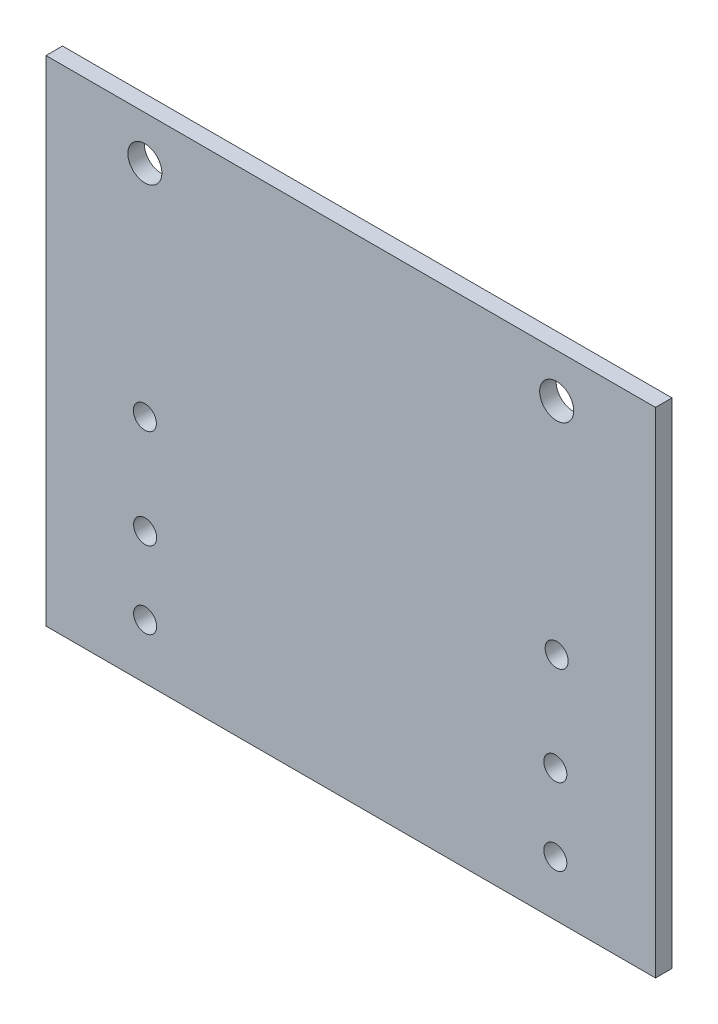
ISO-10303-21;
HEADER;
FILE_DESCRIPTION(('STEP AP214'),'2;1');
FILE_NAME('part.step','',(''),(''),'','','');
FILE_SCHEMA(('AUTOMOTIVE_DESIGN { 1 0 10303 214 1 1 1 1 }'));
ENDSEC;
DATA;
#1=APPLICATION_CONTEXT('core data for automotive mechanical design processes');
#2=APPLICATION_PROTOCOL_DEFINITION('international standard','automotive_design',2000,#1);
#3=PRODUCT_CONTEXT('',#1,'mechanical');
#4=PRODUCT('Part','Part','',(#3));
#5=PRODUCT_RELATED_PRODUCT_CATEGORY('part','',(#4));
#6=PRODUCT_DEFINITION_FORMATION('','',#4);
#7=PRODUCT_DEFINITION_CONTEXT('part definition',#1,'design');
#8=PRODUCT_DEFINITION('design','',#6,#7);
#9=PRODUCT_DEFINITION_SHAPE('','',#8);
#10=(LENGTH_UNIT() NAMED_UNIT(*) SI_UNIT(.MILLI.,.METRE.));
#11=(NAMED_UNIT(*) PLANE_ANGLE_UNIT() SI_UNIT($,.RADIAN.));
#12=(NAMED_UNIT(*) SI_UNIT($,.STERADIAN.) SOLID_ANGLE_UNIT());
#13=UNCERTAINTY_MEASURE_WITH_UNIT(LENGTH_MEASURE(1.E-05),#10,'distance_accuracy_value','');
#14=(GEOMETRIC_REPRESENTATION_CONTEXT(3) GLOBAL_UNCERTAINTY_ASSIGNED_CONTEXT((#13)) GLOBAL_UNIT_ASSIGNED_CONTEXT((#10,
#11,#12)) REPRESENTATION_CONTEXT('',''));
#15=CARTESIAN_POINT('',(0.,0.,0.));
#16=DIRECTION('',(0.,0.,1.));
#17=DIRECTION('',(1.,0.,0.));
#18=AXIS2_PLACEMENT_3D('',#15,#16,#17);
#19=CARTESIAN_POINT('',(0.,0.,3.));
#20=DIRECTION('',(1.,0.,0.));
#21=DIRECTION('',(0.,0.,-1.));
#22=AXIS2_PLACEMENT_3D('',#19,#20,#21);
#23=PLANE('',#22);
#24=DIRECTION('',(0.,-1.,0.));
#25=VECTOR('',#24,1.);
#26=CARTESIAN_POINT('',(0.,0.,0.));
#27=LINE('',#26,#25);
#28=CARTESIAN_POINT('',(0.,90.,0.));
#29=VERTEX_POINT('',#28);
#30=CARTESIAN_POINT('',(0.,0.,0.));
#31=VERTEX_POINT('',#30);
#32=EDGE_CURVE('E112',#29,#31,#27,.T.);
#33=ORIENTED_EDGE('',*,*,#32,.T.);
#34=DIRECTION('',(0.,0.,-1.));
#35=VECTOR('',#34,1.);
#36=CARTESIAN_POINT('',(0.,0.,3.));
#37=LINE('',#36,#35);
#38=CARTESIAN_POINT('',(0.,0.,3.));
#39=VERTEX_POINT('',#38);
#40=EDGE_CURVE('E11',#39,#31,#37,.T.);
#41=ORIENTED_EDGE('',*,*,#40,.F.);
#42=DIRECTION('',(0.,-1.,0.));
#43=VECTOR('',#42,1.);
#44=CARTESIAN_POINT('',(0.,0.,3.));
#45=LINE('',#44,#43);
#46=CARTESIAN_POINT('',(0.,90.,3.));
#47=VERTEX_POINT('',#46);
#48=EDGE_CURVE('E96',#47,#39,#45,.T.);
#49=ORIENTED_EDGE('',*,*,#48,.F.);
#50=DIRECTION('',(0.,0.,-1.));
#51=VECTOR('',#50,1.);
#52=CARTESIAN_POINT('',(0.,90.,3.));
#53=LINE('',#52,#51);
#54=EDGE_CURVE('E108',#47,#29,#53,.T.);
#55=ORIENTED_EDGE('',*,*,#54,.T.);
#56=EDGE_LOOP('',(#33,#41,#49,#55));
#57=FACE_BOUND('',#56,.T.);
#58=ADVANCED_FACE('F44',(#57),#23,.F.);
#59=CARTESIAN_POINT('',(0.,0.,3.));
#60=DIRECTION('',(0.,1.,0.));
#61=DIRECTION('',(0.,0.,1.));
#62=AXIS2_PLACEMENT_3D('',#59,#60,#61);
#63=PLANE('',#62);
#64=DIRECTION('',(1.,0.,0.));
#65=VECTOR('',#64,1.);
#66=CARTESIAN_POINT('',(0.,0.,0.));
#67=LINE('',#66,#65);
#68=CARTESIAN_POINT('',(111.,0.,0.));
#69=VERTEX_POINT('',#68);
#70=EDGE_CURVE('E101',#31,#69,#67,.T.);
#71=ORIENTED_EDGE('',*,*,#70,.T.);
#72=DIRECTION('',(0.,0.,-1.));
#73=VECTOR('',#72,1.);
#74=CARTESIAN_POINT('',(111.,0.,3.));
#75=LINE('',#74,#73);
#76=CARTESIAN_POINT('',(111.,0.,3.));
#77=VERTEX_POINT('',#76);
#78=EDGE_CURVE('E53',#77,#69,#75,.T.);
#79=ORIENTED_EDGE('',*,*,#78,.F.);
#80=DIRECTION('',(1.,0.,0.));
#81=VECTOR('',#80,1.);
#82=CARTESIAN_POINT('',(0.,0.,3.));
#83=LINE('',#82,#81);
#84=EDGE_CURVE('E91',#39,#77,#83,.T.);
#85=ORIENTED_EDGE('',*,*,#84,.F.);
#86=ORIENTED_EDGE('',*,*,#40,.T.);
#87=EDGE_LOOP('',(#71,#79,#85,#86));
#88=FACE_BOUND('',#87,.T.);
#89=ADVANCED_FACE('F100',(#88),#63,.F.);
#90=CARTESIAN_POINT('',(111.,0.,3.));
#91=DIRECTION('',(-1.,0.,0.));
#92=DIRECTION('',(0.,0.,1.));
#93=AXIS2_PLACEMENT_3D('',#90,#91,#92);
#94=PLANE('',#93);
#95=DIRECTION('',(0.,1.,0.));
#96=VECTOR('',#95,1.);
#97=CARTESIAN_POINT('',(111.,0.,0.));
#98=LINE('',#97,#96);
#99=CARTESIAN_POINT('',(111.,90.,0.));
#100=VERTEX_POINT('',#99);
#101=EDGE_CURVE('E78',#69,#100,#98,.T.);
#102=ORIENTED_EDGE('',*,*,#101,.T.);
#103=DIRECTION('',(0.,0.,-1.));
#104=VECTOR('',#103,1.);
#105=CARTESIAN_POINT('',(111.,90.,3.));
#106=LINE('',#105,#104);
#107=CARTESIAN_POINT('',(111.,90.,3.));
#108=VERTEX_POINT('',#107);
#109=EDGE_CURVE('E103',#108,#100,#106,.T.);
#110=ORIENTED_EDGE('',*,*,#109,.F.);
#111=DIRECTION('',(0.,1.,0.));
#112=VECTOR('',#111,1.);
#113=CARTESIAN_POINT('',(111.,0.,3.));
#114=LINE('',#113,#112);
#115=EDGE_CURVE('E94',#77,#108,#114,.T.);
#116=ORIENTED_EDGE('',*,*,#115,.F.);
#117=ORIENTED_EDGE('',*,*,#78,.T.);
#118=EDGE_LOOP('',(#102,#110,#116,#117));
#119=FACE_BOUND('',#118,.T.);
#120=ADVANCED_FACE('F104',(#119),#94,.F.);
#121=CARTESIAN_POINT('',(0.,90.,3.));
#122=DIRECTION('',(0.,-1.,0.));
#123=DIRECTION('',(0.,0.,-1.));
#124=AXIS2_PLACEMENT_3D('',#121,#122,#123);
#125=PLANE('',#124);
#126=DIRECTION('',(-1.,0.,0.));
#127=VECTOR('',#126,1.);
#128=CARTESIAN_POINT('',(0.,90.,0.));
#129=LINE('',#128,#127);
#130=EDGE_CURVE('E84',#100,#29,#129,.T.);
#131=ORIENTED_EDGE('',*,*,#130,.T.);
#132=ORIENTED_EDGE('',*,*,#54,.F.);
#133=DIRECTION('',(-1.,0.,0.));
#134=VECTOR('',#133,1.);
#135=CARTESIAN_POINT('',(0.,90.,3.));
#136=LINE('',#135,#134);
#137=EDGE_CURVE('E61',#108,#47,#136,.T.);
#138=ORIENTED_EDGE('',*,*,#137,.F.);
#139=ORIENTED_EDGE('',*,*,#109,.T.);
#140=EDGE_LOOP('',(#131,#132,#138,#139));
#141=FACE_BOUND('',#140,.T.);
#142=ADVANCED_FACE('F126',(#141),#125,.F.);
#143=CARTESIAN_POINT('',(0.,0.,3.));
#144=DIRECTION('',(0.,0.,-1.));
#145=DIRECTION('',(-1.,0.,0.));
#146=AXIS2_PLACEMENT_3D('',#143,#144,#145);
#147=PLANE('',#146);
#148=CARTESIAN_POINT('',(17.9999999999999,81.9999999999999,3.));
#149=DIRECTION('',(0.,0.,1.));
#150=DIRECTION('',(-1.,0.,0.));
#151=AXIS2_PLACEMENT_3D('',#148,#149,#150);
#152=CIRCLE('',#151,3.1);
#153=CARTESIAN_POINT('',(14.8999999999999,81.9999999999999,3.));
#154=VERTEX_POINT('',#153);
#155=EDGE_CURVE('E177',#154,#154,#152,.T.);
#156=ORIENTED_EDGE('',*,*,#155,.F.);
#157=EDGE_LOOP('',(#156));
#158=FACE_BOUND('',#157,.T.);
#159=CARTESIAN_POINT('',(17.9999999999999,41.9999999999998,3.));
#160=DIRECTION('',(0.,0.,1.));
#161=DIRECTION('',(-1.,0.,0.));
#162=AXIS2_PLACEMENT_3D('',#159,#160,#161);
#163=CIRCLE('',#162,2.1);
#164=CARTESIAN_POINT('',(15.8999999999999,41.9999999999998,3.));
#165=VERTEX_POINT('',#164);
#166=EDGE_CURVE('E185',#165,#165,#163,.T.);
#167=ORIENTED_EDGE('',*,*,#166,.F.);
#168=EDGE_LOOP('',(#167));
#169=FACE_BOUND('',#168,.T.);
#170=CARTESIAN_POINT('',(93.0000000000001,41.9999999999998,3.));
#171=DIRECTION('',(0.,0.,1.));
#172=DIRECTION('',(1.,0.,0.));
#173=AXIS2_PLACEMENT_3D('',#170,#171,#172);
#174=CIRCLE('',#173,2.1);
#175=CARTESIAN_POINT('',(95.1000000000001,41.9999999999998,3.));
#176=VERTEX_POINT('',#175);
#177=EDGE_CURVE('E169',#176,#176,#174,.T.);
#178=ORIENTED_EDGE('',*,*,#177,.F.);
#179=EDGE_LOOP('',(#178));
#180=FACE_BOUND('',#179,.T.);
#181=CARTESIAN_POINT('',(93.0000000000001,81.9999999999999,3.));
#182=DIRECTION('',(0.,0.,1.));
#183=DIRECTION('',(1.,0.,0.));
#184=AXIS2_PLACEMENT_3D('',#181,#182,#183);
#185=CIRCLE('',#184,3.1);
#186=CARTESIAN_POINT('',(96.1000000000001,81.9999999999999,3.));
#187=VERTEX_POINT('',#186);
#188=EDGE_CURVE('E165',#187,#187,#185,.T.);
#189=ORIENTED_EDGE('',*,*,#188,.F.);
#190=EDGE_LOOP('',(#189));
#191=FACE_BOUND('',#190,.T.);
#192=CARTESIAN_POINT('',(18.0500000000001,9.99999999999986,3.));
#193=DIRECTION('',(0.,0.,1.));
#194=DIRECTION('',(1.,0.,0.));
#195=AXIS2_PLACEMENT_3D('',#192,#193,#194);
#196=CIRCLE('',#195,2.1);
#197=CARTESIAN_POINT('',(20.1500000000001,9.99999999999986,3.));
#198=VERTEX_POINT('',#197);
#199=EDGE_CURVE('E150',#198,#198,#196,.T.);
#200=ORIENTED_EDGE('',*,*,#199,.F.);
#201=EDGE_LOOP('',(#200));
#202=FACE_BOUND('',#201,.T.);
#203=CARTESIAN_POINT('',(92.7499999999999,23.9999999999999,3.));
#204=DIRECTION('',(0.,0.,1.));
#205=DIRECTION('',(1.,0.,0.));
#206=AXIS2_PLACEMENT_3D('',#203,#204,#205);
#207=CIRCLE('',#206,2.1);
#208=CARTESIAN_POINT('',(94.85,23.9999999999999,3.));
#209=VERTEX_POINT('',#208);
#210=EDGE_CURVE('E141',#209,#209,#207,.T.);
#211=ORIENTED_EDGE('',*,*,#210,.F.);
#212=EDGE_LOOP('',(#211));
#213=FACE_BOUND('',#212,.T.);
#214=CARTESIAN_POINT('',(92.7499999999999,9.99999999999986,3.));
#215=DIRECTION('',(0.,0.,1.));
#216=DIRECTION('',(1.,0.,0.));
#217=AXIS2_PLACEMENT_3D('',#214,#215,#216);
#218=CIRCLE('',#217,2.1);
#219=CARTESIAN_POINT('',(94.85,9.99999999999986,3.));
#220=VERTEX_POINT('',#219);
#221=EDGE_CURVE('E157',#220,#220,#218,.T.);
#222=ORIENTED_EDGE('',*,*,#221,.F.);
#223=EDGE_LOOP('',(#222));
#224=FACE_BOUND('',#223,.T.);
#225=CARTESIAN_POINT('',(18.0500000000001,23.9999999999999,3.));
#226=DIRECTION('',(0.,0.,1.));
#227=DIRECTION('',(1.,0.,0.));
#228=AXIS2_PLACEMENT_3D('',#225,#226,#227);
#229=CIRCLE('',#228,2.1);
#230=CARTESIAN_POINT('',(20.1500000000001,23.9999999999999,3.));
#231=VERTEX_POINT('',#230);
#232=EDGE_CURVE('E133',#231,#231,#229,.T.);
#233=ORIENTED_EDGE('',*,*,#232,.F.);
#234=EDGE_LOOP('',(#233));
#235=FACE_BOUND('',#234,.T.);
#236=ORIENTED_EDGE('',*,*,#48,.T.);
#237=ORIENTED_EDGE('',*,*,#84,.T.);
#238=ORIENTED_EDGE('',*,*,#115,.T.);
#239=ORIENTED_EDGE('',*,*,#137,.T.);
#240=EDGE_LOOP('',(#236,#237,#238,#239));
#241=FACE_BOUND('',#240,.T.);
#242=ADVANCED_FACE('F92',(#158,#169,#180,#191,#202,#213,#224,#235,#241),#147,.F.);
#243=CARTESIAN_POINT('',(0.,0.,0.));
#244=DIRECTION('',(0.,0.,-1.));
#245=DIRECTION('',(-1.,0.,0.));
#246=AXIS2_PLACEMENT_3D('',#243,#244,#245);
#247=PLANE('',#246);
#248=CARTESIAN_POINT('',(17.9999999999999,81.9999999999999,0.));
#249=DIRECTION('',(0.,0.,1.));
#250=DIRECTION('',(-1.,0.,0.));
#251=AXIS2_PLACEMENT_3D('',#248,#249,#250);
#252=CIRCLE('',#251,3.1);
#253=CARTESIAN_POINT('',(14.8999999999999,81.9999999999999,0.));
#254=VERTEX_POINT('',#253);
#255=EDGE_CURVE('E173',#254,#254,#252,.T.);
#256=ORIENTED_EDGE('',*,*,#255,.T.);
#257=EDGE_LOOP('',(#256));
#258=FACE_BOUND('',#257,.T.);
#259=CARTESIAN_POINT('',(17.9999999999999,41.9999999999998,0.));
#260=DIRECTION('',(0.,0.,1.));
#261=DIRECTION('',(-1.,0.,0.));
#262=AXIS2_PLACEMENT_3D('',#259,#260,#261);
#263=CIRCLE('',#262,2.1);
#264=CARTESIAN_POINT('',(15.8999999999999,41.9999999999998,0.));
#265=VERTEX_POINT('',#264);
#266=EDGE_CURVE('E181',#265,#265,#263,.T.);
#267=ORIENTED_EDGE('',*,*,#266,.T.);
#268=EDGE_LOOP('',(#267));
#269=FACE_BOUND('',#268,.T.);
#270=CARTESIAN_POINT('',(93.0000000000001,41.9999999999998,0.));
#271=DIRECTION('',(0.,0.,1.));
#272=DIRECTION('',(1.,0.,0.));
#273=AXIS2_PLACEMENT_3D('',#270,#271,#272);
#274=CIRCLE('',#273,2.1);
#275=CARTESIAN_POINT('',(95.1000000000001,41.9999999999998,0.));
#276=VERTEX_POINT('',#275);
#277=EDGE_CURVE('E189',#276,#276,#274,.T.);
#278=ORIENTED_EDGE('',*,*,#277,.T.);
#279=EDGE_LOOP('',(#278));
#280=FACE_BOUND('',#279,.T.);
#281=CARTESIAN_POINT('',(93.0000000000001,81.9999999999999,0.));
#282=DIRECTION('',(0.,0.,1.));
#283=DIRECTION('',(1.,0.,0.));
#284=AXIS2_PLACEMENT_3D('',#281,#282,#283);
#285=CIRCLE('',#284,3.1);
#286=CARTESIAN_POINT('',(96.1000000000001,81.9999999999999,0.));
#287=VERTEX_POINT('',#286);
#288=EDGE_CURVE('E161',#287,#287,#285,.T.);
#289=ORIENTED_EDGE('',*,*,#288,.T.);
#290=EDGE_LOOP('',(#289));
#291=FACE_BOUND('',#290,.T.);
#292=CARTESIAN_POINT('',(18.0500000000001,9.99999999999986,0.));
#293=DIRECTION('',(0.,0.,1.));
#294=DIRECTION('',(1.,0.,0.));
#295=AXIS2_PLACEMENT_3D('',#292,#293,#294);
#296=CIRCLE('',#295,2.1);
#297=CARTESIAN_POINT('',(20.1500000000001,9.99999999999986,0.));
#298=VERTEX_POINT('',#297);
#299=EDGE_CURVE('E137',#298,#298,#296,.T.);
#300=ORIENTED_EDGE('',*,*,#299,.T.);
#301=EDGE_LOOP('',(#300));
#302=FACE_BOUND('',#301,.T.);
#303=CARTESIAN_POINT('',(92.7499999999999,23.9999999999999,0.));
#304=DIRECTION('',(0.,0.,1.));
#305=DIRECTION('',(1.,0.,0.));
#306=AXIS2_PLACEMENT_3D('',#303,#304,#305);
#307=CIRCLE('',#306,2.1);
#308=CARTESIAN_POINT('',(94.85,23.9999999999999,0.));
#309=VERTEX_POINT('',#308);
#310=EDGE_CURVE('E145',#309,#309,#307,.T.);
#311=ORIENTED_EDGE('',*,*,#310,.T.);
#312=EDGE_LOOP('',(#311));
#313=FACE_BOUND('',#312,.T.);
#314=CARTESIAN_POINT('',(92.7499999999999,9.99999999999986,0.));
#315=DIRECTION('',(0.,0.,1.));
#316=DIRECTION('',(1.,0.,0.));
#317=AXIS2_PLACEMENT_3D('',#314,#315,#316);
#318=CIRCLE('',#317,2.1);
#319=CARTESIAN_POINT('',(94.85,9.99999999999986,0.));
#320=VERTEX_POINT('',#319);
#321=EDGE_CURVE('E146',#320,#320,#318,.T.);
#322=ORIENTED_EDGE('',*,*,#321,.T.);
#323=EDGE_LOOP('',(#322));
#324=FACE_BOUND('',#323,.T.);
#325=CARTESIAN_POINT('',(18.0500000000001,23.9999999999999,0.));
#326=DIRECTION('',(0.,0.,1.));
#327=DIRECTION('',(1.,0.,0.));
#328=AXIS2_PLACEMENT_3D('',#325,#326,#327);
#329=CIRCLE('',#328,2.1);
#330=CARTESIAN_POINT('',(20.1500000000001,23.9999999999999,0.));
#331=VERTEX_POINT('',#330);
#332=EDGE_CURVE('E116',#331,#331,#329,.T.);
#333=ORIENTED_EDGE('',*,*,#332,.T.);
#334=EDGE_LOOP('',(#333));
#335=FACE_BOUND('',#334,.T.);
#336=ORIENTED_EDGE('',*,*,#32,.F.);
#337=ORIENTED_EDGE('',*,*,#130,.F.);
#338=ORIENTED_EDGE('',*,*,#101,.F.);
#339=ORIENTED_EDGE('',*,*,#70,.F.);
#340=EDGE_LOOP('',(#336,#337,#338,#339));
#341=FACE_BOUND('',#340,.T.);
#342=ADVANCED_FACE('F129',(#258,#269,#280,#291,#302,#313,#324,#335,#341),#247,.T.);
#343=CARTESIAN_POINT('',(18.0500000000001,23.9999999999999,0.));
#344=DIRECTION('',(0.,0.,1.));
#345=DIRECTION('',(1.,0.,0.));
#346=AXIS2_PLACEMENT_3D('',#343,#344,#345);
#347=CYLINDRICAL_SURFACE('',#346,2.1);
#348=ORIENTED_EDGE('',*,*,#332,.F.);
#349=EDGE_LOOP('',(#348));
#350=FACE_BOUND('',#349,.T.);
#351=ORIENTED_EDGE('',*,*,#232,.T.);
#352=EDGE_LOOP('',(#351));
#353=FACE_BOUND('',#352,.T.);
#354=ADVANCED_FACE('F213',(#350,#353),#347,.F.);
#355=CARTESIAN_POINT('',(92.7499999999999,9.99999999999986,0.));
#356=DIRECTION('',(0.,0.,1.));
#357=DIRECTION('',(1.,0.,0.));
#358=AXIS2_PLACEMENT_3D('',#355,#356,#357);
#359=CYLINDRICAL_SURFACE('',#358,2.1);
#360=ORIENTED_EDGE('',*,*,#321,.F.);
#361=EDGE_LOOP('',(#360));
#362=FACE_BOUND('',#361,.T.);
#363=ORIENTED_EDGE('',*,*,#221,.T.);
#364=EDGE_LOOP('',(#363));
#365=FACE_BOUND('',#364,.T.);
#366=ADVANCED_FACE('F215',(#362,#365),#359,.F.);
#367=CARTESIAN_POINT('',(92.7499999999999,23.9999999999999,0.));
#368=DIRECTION('',(0.,0.,1.));
#369=DIRECTION('',(1.,0.,0.));
#370=AXIS2_PLACEMENT_3D('',#367,#368,#369);
#371=CYLINDRICAL_SURFACE('',#370,2.1);
#372=ORIENTED_EDGE('',*,*,#310,.F.);
#373=EDGE_LOOP('',(#372));
#374=FACE_BOUND('',#373,.T.);
#375=ORIENTED_EDGE('',*,*,#210,.T.);
#376=EDGE_LOOP('',(#375));
#377=FACE_BOUND('',#376,.T.);
#378=ADVANCED_FACE('F222',(#374,#377),#371,.F.);
#379=CARTESIAN_POINT('',(18.0500000000001,9.99999999999986,0.));
#380=DIRECTION('',(0.,0.,1.));
#381=DIRECTION('',(1.,0.,0.));
#382=AXIS2_PLACEMENT_3D('',#379,#380,#381);
#383=CYLINDRICAL_SURFACE('',#382,2.1);
#384=ORIENTED_EDGE('',*,*,#299,.F.);
#385=EDGE_LOOP('',(#384));
#386=FACE_BOUND('',#385,.T.);
#387=ORIENTED_EDGE('',*,*,#199,.T.);
#388=EDGE_LOOP('',(#387));
#389=FACE_BOUND('',#388,.T.);
#390=ADVANCED_FACE('F283',(#386,#389),#383,.F.);
#391=CARTESIAN_POINT('',(93.0000000000001,81.9999999999999,0.));
#392=DIRECTION('',(0.,0.,1.));
#393=DIRECTION('',(1.,0.,0.));
#394=AXIS2_PLACEMENT_3D('',#391,#392,#393);
#395=CYLINDRICAL_SURFACE('',#394,3.1);
#396=ORIENTED_EDGE('',*,*,#288,.F.);
#397=EDGE_LOOP('',(#396));
#398=FACE_BOUND('',#397,.T.);
#399=ORIENTED_EDGE('',*,*,#188,.T.);
#400=EDGE_LOOP('',(#399));
#401=FACE_BOUND('',#400,.T.);
#402=ADVANCED_FACE('F291',(#398,#401),#395,.F.);
#403=CARTESIAN_POINT('',(93.0000000000001,41.9999999999998,0.));
#404=DIRECTION('',(0.,0.,1.));
#405=DIRECTION('',(1.,0.,0.));
#406=AXIS2_PLACEMENT_3D('',#403,#404,#405);
#407=CYLINDRICAL_SURFACE('',#406,2.1);
#408=ORIENTED_EDGE('',*,*,#277,.F.);
#409=EDGE_LOOP('',(#408));
#410=FACE_BOUND('',#409,.T.);
#411=ORIENTED_EDGE('',*,*,#177,.T.);
#412=EDGE_LOOP('',(#411));
#413=FACE_BOUND('',#412,.T.);
#414=ADVANCED_FACE('F197',(#410,#413),#407,.F.);
#415=CARTESIAN_POINT('',(17.9999999999999,41.9999999999998,0.));
#416=DIRECTION('',(0.,0.,1.));
#417=DIRECTION('',(1.,0.,0.));
#418=AXIS2_PLACEMENT_3D('',#415,#416,#417);
#419=CYLINDRICAL_SURFACE('',#418,2.1);
#420=ORIENTED_EDGE('',*,*,#266,.F.);
#421=EDGE_LOOP('',(#420));
#422=FACE_BOUND('',#421,.T.);
#423=ORIENTED_EDGE('',*,*,#166,.T.);
#424=EDGE_LOOP('',(#423));
#425=FACE_BOUND('',#424,.T.);
#426=ADVANCED_FACE('F308',(#422,#425),#419,.F.);
#427=CARTESIAN_POINT('',(17.9999999999999,81.9999999999999,0.));
#428=DIRECTION('',(0.,0.,1.));
#429=DIRECTION('',(1.,0.,0.));
#430=AXIS2_PLACEMENT_3D('',#427,#428,#429);
#431=CYLINDRICAL_SURFACE('',#430,3.1);
#432=ORIENTED_EDGE('',*,*,#255,.F.);
#433=EDGE_LOOP('',(#432));
#434=FACE_BOUND('',#433,.T.);
#435=ORIENTED_EDGE('',*,*,#155,.T.);
#436=EDGE_LOOP('',(#435));
#437=FACE_BOUND('',#436,.T.);
#438=ADVANCED_FACE('F317',(#434,#437),#431,.F.);
#439=CLOSED_SHELL('',(#58,#89,#120,#142,#242,#342,#354,#366,#378,#390,#402,#414,#426,#438));
#440=MANIFOLD_SOLID_BREP('B2',#439);
#441=ADVANCED_BREP_SHAPE_REPRESENTATION('',(#18,#440),#14);
#442=SHAPE_DEFINITION_REPRESENTATION(#9,#441);
ENDSEC;
END-ISO-10303-21;
